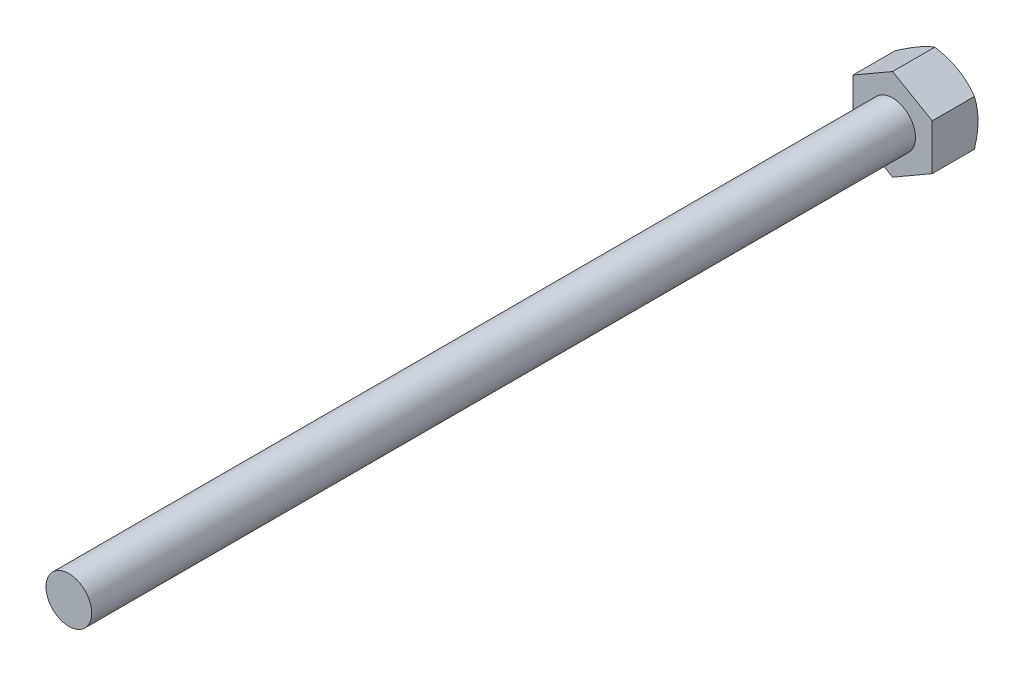
ISO-10303-21;
HEADER;
FILE_DESCRIPTION(('STEP AP214'),'2;1');
FILE_NAME('part.step','',(''),(''),'','','');
FILE_SCHEMA(('AUTOMOTIVE_DESIGN { 1 0 10303 214 1 1 1 1 }'));
ENDSEC;
DATA;
#1=APPLICATION_CONTEXT('core data for automotive mechanical design processes');
#2=APPLICATION_PROTOCOL_DEFINITION('international standard','automotive_design',2000,#1);
#3=PRODUCT_CONTEXT('',#1,'mechanical');
#4=PRODUCT('Part','Part','',(#3));
#5=PRODUCT_RELATED_PRODUCT_CATEGORY('part','',(#4));
#6=PRODUCT_DEFINITION_FORMATION('','',#4);
#7=PRODUCT_DEFINITION_CONTEXT('part definition',#1,'design');
#8=PRODUCT_DEFINITION('design','',#6,#7);
#9=PRODUCT_DEFINITION_SHAPE('','',#8);
#10=(LENGTH_UNIT() NAMED_UNIT(*) SI_UNIT(.MILLI.,.METRE.));
#11=(NAMED_UNIT(*) PLANE_ANGLE_UNIT() SI_UNIT($,.RADIAN.));
#12=(NAMED_UNIT(*) SI_UNIT($,.STERADIAN.) SOLID_ANGLE_UNIT());
#13=UNCERTAINTY_MEASURE_WITH_UNIT(LENGTH_MEASURE(1.E-05),#10,'distance_accuracy_value','');
#14=(GEOMETRIC_REPRESENTATION_CONTEXT(3) GLOBAL_UNCERTAINTY_ASSIGNED_CONTEXT((#13)) GLOBAL_UNIT_ASSIGNED_CONTEXT((#10,
#11,#12)) REPRESENTATION_CONTEXT('',''));
#15=CARTESIAN_POINT('',(0.,0.,0.));
#16=DIRECTION('',(0.,0.,1.));
#17=DIRECTION('',(1.,0.,0.));
#18=AXIS2_PLACEMENT_3D('',#15,#16,#17);
#19=CARTESIAN_POINT('',(0.,0.,-76.));
#20=DIRECTION('',(0.,0.,1.));
#21=DIRECTION('',(1.,0.,0.));
#22=AXIS2_PLACEMENT_3D('',#19,#20,#21);
#23=PLANE('',#22);
#24=CARTESIAN_POINT('',(9.49999999999999,-24.,-76.0000000000218));
#25=DIRECTION('',(0.,0.,1.));
#26=DIRECTION('',(1.,0.,0.));
#27=AXIS2_PLACEMENT_3D('',#24,#25,#26);
#28=CIRCLE('',#27,3.46410161511993);
#29=CARTESIAN_POINT('',(11.2320508075644,-26.9999999999923,-76.0000000000167));
#30=VERTEX_POINT('',#29);
#31=CARTESIAN_POINT('',(12.9641016151288,-24.,-76.0000000000167));
#32=VERTEX_POINT('',#31);
#33=EDGE_CURVE('E89',#30,#32,#28,.T.);
#34=ORIENTED_EDGE('',*,*,#33,.F.);
#35=CARTESIAN_POINT('',(9.49999999999999,-24.,-76.0000000000218));
#36=DIRECTION('',(0.,0.,1.));
#37=DIRECTION('',(1.,0.,0.));
#38=AXIS2_PLACEMENT_3D('',#35,#36,#37);
#39=CIRCLE('',#38,3.46410161511994);
#40=CARTESIAN_POINT('',(7.76794919243556,-26.9999999999923,-76.0000000000167));
#41=VERTEX_POINT('',#40);
#42=EDGE_CURVE('E87',#41,#30,#39,.T.);
#43=ORIENTED_EDGE('',*,*,#42,.F.);
#44=CARTESIAN_POINT('',(9.49999999999999,-24.,-76.0000000000218));
#45=DIRECTION('',(0.,0.,1.));
#46=DIRECTION('',(1.,0.,0.));
#47=AXIS2_PLACEMENT_3D('',#44,#45,#46);
#48=CIRCLE('',#47,3.46410161511993);
#49=CARTESIAN_POINT('',(6.03589838487115,-24.,-76.0000000000167));
#50=VERTEX_POINT('',#49);
#51=EDGE_CURVE('E20',#50,#41,#48,.T.);
#52=ORIENTED_EDGE('',*,*,#51,.F.);
#53=CARTESIAN_POINT('',(9.49999999999999,-24.,-76.0000000000218));
#54=DIRECTION('',(0.,0.,1.));
#55=DIRECTION('',(1.,0.,0.));
#56=AXIS2_PLACEMENT_3D('',#53,#54,#55);
#57=CIRCLE('',#56,3.46410161511994);
#58=CARTESIAN_POINT('',(7.76794919243557,-21.0000000000077,-76.0000000000167));
#59=VERTEX_POINT('',#58);
#60=EDGE_CURVE('E254',#59,#50,#57,.T.);
#61=ORIENTED_EDGE('',*,*,#60,.F.);
#62=CARTESIAN_POINT('',(9.49999999999999,-24.,-76.0000000000218));
#63=DIRECTION('',(0.,0.,1.));
#64=DIRECTION('',(1.,0.,0.));
#65=AXIS2_PLACEMENT_3D('',#62,#63,#64);
#66=CIRCLE('',#65,3.46410161511994);
#67=CARTESIAN_POINT('',(11.2320508075644,-21.0000000000077,-76.0000000000167));
#68=VERTEX_POINT('',#67);
#69=EDGE_CURVE('E256',#68,#59,#66,.T.);
#70=ORIENTED_EDGE('',*,*,#69,.F.);
#71=CARTESIAN_POINT('',(9.49999999999999,-24.,-76.0000000000218));
#72=DIRECTION('',(0.,0.,1.));
#73=DIRECTION('',(1.,0.,0.));
#74=AXIS2_PLACEMENT_3D('',#71,#72,#73);
#75=CIRCLE('',#74,3.46410161511993);
#76=EDGE_CURVE('E259',#32,#68,#75,.T.);
#77=ORIENTED_EDGE('',*,*,#76,.F.);
#78=EDGE_LOOP('',(#34,#43,#52,#61,#70,#77));
#79=FACE_BOUND('',#78,.T.);
#80=ADVANCED_FACE('F17',(#79),#23,.F.);
#81=CARTESIAN_POINT('',(9.49999999999999,-24.,-75.6887425167747));
#82=DIRECTION('',(0.,0.,1.));
#83=DIRECTION('',(1.,0.,0.));
#84=AXIS2_PLACEMENT_3D('',#81,#82,#83);
#85=CONICAL_SURFACE('',#84,4.00321539035257,1.04719755120672);
#86=ORIENTED_EDGE('',*,*,#51,.T.);
#87=CARTESIAN_POINT('',(7.76794919243111,-27.,-76.0000000000115));
#88=CARTESIAN_POINT('',(7.69443335230534,-26.9575556099137,-76.0000141576657));
#89=CARTESIAN_POINT('',(7.62092105368685,-26.9151132645176,-75.9981988123392));
#90=CARTESIAN_POINT('',(7.47404079889175,-26.830311909873,-75.9910143426388));
#91=CARTESIAN_POINT('',(7.40067281702326,-26.7879528857913,-75.9856459218011));
#92=CARTESIAN_POINT('',(7.25455509466502,-26.7035917794544,-75.9714958787991));
#93=CARTESIAN_POINT('',(7.18180409659045,-26.6615889711322,-75.9627314394535));
#94=CARTESIAN_POINT('',(7.0366487113633,-26.577783470397,-75.9419778858792));
#95=CARTESIAN_POINT('',(6.96424433338508,-26.5359807832808,-75.9299886867723));
#96=CARTESIAN_POINT('',(6.74785125175674,-26.4110461793519,-75.889554327723));
#97=CARTESIAN_POINT('',(6.60449117811679,-26.3282772022448,-75.8566227722629));
#98=CARTESIAN_POINT('',(6.31900386451644,-26.1634510248874,-75.7806741823391));
#99=CARTESIAN_POINT('',(6.17688658261098,-26.0813995739228,-75.7376067792515));
#100=CARTESIAN_POINT('',(6.03589838485792,-25.9999999999975,-75.6905989232588));
#101=B_SPLINE_CURVE_WITH_KNOTS('',3,(#87,#88,#89,#90,#91,#92,#93,#94,#95,#96,#97,#98,#99,#100),
.UNSPECIFIED.,.F.,.F.,(4,2,2,2,2,2,4),(0.,0.254640351353358,0.509230297054508,0.762548570682986,
1.01587351249356,1.52185943681017,2.03041495159137),.UNSPECIFIED.);
#102=CARTESIAN_POINT('',(6.03589838486008,-26.0000000000013,-75.6905989232588));
#103=VERTEX_POINT('',#102);
#104=EDGE_CURVE('E97',#41,#103,#101,.T.);
#105=ORIENTED_EDGE('',*,*,#104,.T.);
#106=CARTESIAN_POINT('',(6.03589838486225,-26.000000000005,-75.6905989232588));
#107=CARTESIAN_POINT('',(6.03589838486225,-25.8372008521544,-75.7376067792515));
#108=CARTESIAN_POINT('',(6.03589838486225,-25.6730979502252,-75.7806741823391));
#109=CARTESIAN_POINT('',(6.03589838486224,-25.3434455955104,-75.8566227722629));
#110=CARTESIAN_POINT('',(6.03589838486224,-25.1779076412963,-75.889554327723));
#111=CARTESIAN_POINT('',(6.03589838486224,-24.9280384334385,-75.9299886867723));
#112=CARTESIAN_POINT('',(6.03589838486224,-24.844433059206,-75.9419778858792));
#113=CARTESIAN_POINT('',(6.03589838486224,-24.6768220577356,-75.9627314394535));
#114=CARTESIAN_POINT('',(6.03589838486224,-24.5928164410913,-75.9714958787991));
#115=CARTESIAN_POINT('',(6.03589838486224,-24.4240942284174,-75.9856459218012));
#116=CARTESIAN_POINT('',(6.03589838486224,-24.3393761802541,-75.9910143426388));
#117=CARTESIAN_POINT('',(6.03589838486224,-24.1697734709649,-75.9981988123392));
#118=CARTESIAN_POINT('',(6.03589838486224,-24.0848887801726,-76.0000141576658));
#119=CARTESIAN_POINT('',(6.03589838486224,-24.,-76.0000000000115));
#120=B_SPLINE_CURVE_WITH_KNOTS('',3,(#106,#107,#108,#109,#110,#111,#112,#113,#114,#115,#116,
#117,#118,#119),.UNSPECIFIED.,.F.,.F.,(4,2,2,2,2,2,4),(0.,0.508555514781208,1.01454143909782,
1.26786638090839,1.52118465453688,1.77577460023803,2.03041495159139),.UNSPECIFIED.);
#121=EDGE_CURVE('E99',#103,#50,#120,.T.);
#122=ORIENTED_EDGE('',*,*,#121,.T.);
#123=EDGE_LOOP('',(#86,#105,#122));
#124=FACE_BOUND('',#123,.T.);
#125=ADVANCED_FACE('F95',(#124),#85,.T.);
#126=CARTESIAN_POINT('',(9.49999999999999,-24.,-75.6887425167747));
#127=DIRECTION('',(0.,0.,1.));
#128=DIRECTION('',(1.,0.,0.));
#129=AXIS2_PLACEMENT_3D('',#126,#127,#128);
#130=CONICAL_SURFACE('',#129,4.00321539035257,1.04719755120672);
#131=CARTESIAN_POINT('',(9.50000000000429,-28.0000000000025,-75.6905989232588));
#132=CARTESIAN_POINT('',(9.35901180225123,-27.9186004260772,-75.7376067792515));
#133=CARTESIAN_POINT('',(9.21689452034578,-27.8365489751126,-75.7806741823391));
#134=CARTESIAN_POINT('',(8.93140720674542,-27.6717227977552,-75.8566227722628));
#135=CARTESIAN_POINT('',(8.78804713310547,-27.5889538206481,-75.889554327723));
#136=CARTESIAN_POINT('',(8.57165405147713,-27.4640192167192,-75.9299886867723));
#137=CARTESIAN_POINT('',(8.49924967349892,-27.422216529603,-75.9419778858792));
#138=CARTESIAN_POINT('',(8.35409428827176,-27.3384110288678,-75.9627314394535));
#139=CARTESIAN_POINT('',(8.28134329019719,-27.2964082205456,-75.9714958787991));
#140=CARTESIAN_POINT('',(8.13522556783896,-27.2120471142087,-75.9856459218011));
#141=CARTESIAN_POINT('',(8.06185758597047,-27.169688090127,-75.9910143426388));
#142=CARTESIAN_POINT('',(7.91497733117537,-27.0848867354825,-75.9981988123392));
#143=CARTESIAN_POINT('',(7.84146503255687,-27.0424443900863,-76.0000141576657));
#144=CARTESIAN_POINT('',(7.76794919243111,-27.,-76.0000000000115));
#145=B_SPLINE_CURVE_WITH_KNOTS('',3,(#131,#132,#133,#134,#135,#136,#137,#138,#139,#140,#141,
#142,#143,#144),.UNSPECIFIED.,.F.,.F.,(4,2,2,2,2,2,4),(0.,0.508555514781195,1.0145414390978,
1.26786638090837,1.52118465453685,1.775774600238,2.03041495159136),.UNSPECIFIED.);
#146=CARTESIAN_POINT('',(9.49999999999996,-28.0000000000025,-75.6905989232588));
#147=VERTEX_POINT('',#146);
#148=EDGE_CURVE('E102',#147,#41,#145,.T.);
#149=ORIENTED_EDGE('',*,*,#148,.T.);
#150=ORIENTED_EDGE('',*,*,#42,.T.);
#151=CARTESIAN_POINT('',(11.2320508075688,-27.,-76.0000000000115));
#152=CARTESIAN_POINT('',(11.1585349674431,-27.0424443900863,-76.0000141576658));
#153=CARTESIAN_POINT('',(11.0850226688246,-27.0848867354825,-75.9981988123392));
#154=CARTESIAN_POINT('',(10.9381424140295,-27.169688090127,-75.9910143426388));
#155=CARTESIAN_POINT('',(10.864774432161,-27.2120471142087,-75.9856459218012));
#156=CARTESIAN_POINT('',(10.7186567098028,-27.2964082205456,-75.9714958787991));
#157=CARTESIAN_POINT('',(10.6459057117282,-27.3384110288678,-75.9627314394535));
#158=CARTESIAN_POINT('',(10.500750326501,-27.422216529603,-75.9419778858792));
#159=CARTESIAN_POINT('',(10.4283459485228,-27.4640192167192,-75.9299886867723));
#160=CARTESIAN_POINT('',(10.2119528668945,-27.5889538206481,-75.889554327723));
#161=CARTESIAN_POINT('',(10.0685927932545,-27.6717227977552,-75.8566227722629));
#162=CARTESIAN_POINT('',(9.78310547965415,-27.8365489751126,-75.7806741823391));
#163=CARTESIAN_POINT('',(9.6409881977487,-27.9186004260772,-75.7376067792515));
#164=CARTESIAN_POINT('',(9.49999999999564,-28.0000000000025,-75.6905989232588));
#165=B_SPLINE_CURVE_WITH_KNOTS('',3,(#151,#152,#153,#154,#155,#156,#157,#158,#159,#160,#161,
#162,#163,#164),.UNSPECIFIED.,.F.,.F.,(4,2,2,2,2,2,4),(0.,0.254640351353363,0.509230297054516,
0.762548570683,1.01587351249357,1.52185943681019,2.03041495159139),.UNSPECIFIED.);
#166=EDGE_CURVE('E105',#30,#147,#165,.T.);
#167=ORIENTED_EDGE('',*,*,#166,.T.);
#168=EDGE_LOOP('',(#149,#150,#167));
#169=FACE_BOUND('',#168,.T.);
#170=ADVANCED_FACE('F103',(#169),#130,.T.);
#171=CARTESIAN_POINT('',(9.49999999999999,-24.,-75.6887425167747));
#172=DIRECTION('',(0.,0.,1.));
#173=DIRECTION('',(1.,0.,0.));
#174=AXIS2_PLACEMENT_3D('',#171,#172,#173);
#175=CONICAL_SURFACE('',#174,4.00321539035257,1.04719755120672);
#176=CARTESIAN_POINT('',(12.9641016151421,-25.9999999999975,-75.6905989232588));
#177=CARTESIAN_POINT('',(12.823113417389,-26.0813995739228,-75.7376067792515));
#178=CARTESIAN_POINT('',(12.6809961354835,-26.1634510248874,-75.7806741823391));
#179=CARTESIAN_POINT('',(12.3955088218832,-26.3282772022448,-75.8566227722629));
#180=CARTESIAN_POINT('',(12.2521487482432,-26.4110461793519,-75.889554327723));
#181=CARTESIAN_POINT('',(12.0357556666149,-26.5359807832808,-75.9299886867723));
#182=CARTESIAN_POINT('',(11.9633512886367,-26.577783470397,-75.9419778858792));
#183=CARTESIAN_POINT('',(11.8181959034095,-26.6615889711322,-75.9627314394535));
#184=CARTESIAN_POINT('',(11.7454449053349,-26.7035917794544,-75.9714958787991));
#185=CARTESIAN_POINT('',(11.5993271829767,-26.7879528857913,-75.9856459218012));
#186=CARTESIAN_POINT('',(11.5259592011082,-26.830311909873,-75.9910143426388));
#187=CARTESIAN_POINT('',(11.3790789463131,-26.9151132645176,-75.9981988123392));
#188=CARTESIAN_POINT('',(11.3055666476946,-26.9575556099137,-76.0000141576658));
#189=CARTESIAN_POINT('',(11.2320508075688,-27.,-76.0000000000115));
#190=B_SPLINE_CURVE_WITH_KNOTS('',3,(#176,#177,#178,#179,#180,#181,#182,#183,#184,#185,#186,
#187,#188,#189),.UNSPECIFIED.,.F.,.F.,(4,2,2,2,2,2,4),(0.,0.508555514781204,1.01454143909782,
1.26786638090839,1.52118465453687,1.77577460023803,2.03041495159139),.UNSPECIFIED.);
#191=CARTESIAN_POINT('',(12.9641016151399,-26.0000000000013,-75.6905989232588));
#192=VERTEX_POINT('',#191);
#193=EDGE_CURVE('E148',#192,#30,#190,.T.);
#194=ORIENTED_EDGE('',*,*,#193,.T.);
#195=ORIENTED_EDGE('',*,*,#33,.T.);
#196=CARTESIAN_POINT('',(12.9641016151377,-24.,-76.0000000000115));
#197=CARTESIAN_POINT('',(12.9641016151377,-24.0848887801726,-76.0000141576658));
#198=CARTESIAN_POINT('',(12.9641016151377,-24.1697734709649,-75.9981988123392));
#199=CARTESIAN_POINT('',(12.9641016151377,-24.3393761802541,-75.9910143426388));
#200=CARTESIAN_POINT('',(12.9641016151377,-24.4240942284174,-75.9856459218012));
#201=CARTESIAN_POINT('',(12.9641016151377,-24.5928164410913,-75.9714958787991));
#202=CARTESIAN_POINT('',(12.9641016151377,-24.6768220577356,-75.9627314394535));
#203=CARTESIAN_POINT('',(12.9641016151377,-24.844433059206,-75.9419778858792));
#204=CARTESIAN_POINT('',(12.9641016151377,-24.9280384334385,-75.9299886867723));
#205=CARTESIAN_POINT('',(12.9641016151377,-25.1779076412963,-75.889554327723));
#206=CARTESIAN_POINT('',(12.9641016151377,-25.3434455955104,-75.8566227722629));
#207=CARTESIAN_POINT('',(12.9641016151377,-25.6730979502252,-75.7806741823391));
#208=CARTESIAN_POINT('',(12.9641016151377,-25.8372008521544,-75.7376067792515));
#209=CARTESIAN_POINT('',(12.9641016151377,-26.000000000005,-75.6905989232588));
#210=B_SPLINE_CURVE_WITH_KNOTS('',3,(#196,#197,#198,#199,#200,#201,#202,#203,#204,#205,#206,
#207,#208,#209),.UNSPECIFIED.,.F.,.F.,(4,2,2,2,2,2,4),(0.,0.254640351353364,0.509230297054517,
0.762548570683004,1.01587351249358,1.52185943681019,2.0304149515914),.UNSPECIFIED.);
#211=EDGE_CURVE('E174',#32,#192,#210,.T.);
#212=ORIENTED_EDGE('',*,*,#211,.T.);
#213=EDGE_LOOP('',(#194,#195,#212));
#214=FACE_BOUND('',#213,.T.);
#215=ADVANCED_FACE('F139',(#214),#175,.T.);
#216=CARTESIAN_POINT('',(9.49999999999999,-24.,-75.6887425167747));
#217=DIRECTION('',(0.,0.,1.));
#218=DIRECTION('',(1.,0.,0.));
#219=AXIS2_PLACEMENT_3D('',#216,#217,#218);
#220=CONICAL_SURFACE('',#219,4.00321539035257,1.04719755120672);
#221=CARTESIAN_POINT('',(12.9641016151377,-21.999999999995,-75.6905989232588));
#222=CARTESIAN_POINT('',(12.9641016151377,-22.1627991478456,-75.7376067792515));
#223=CARTESIAN_POINT('',(12.9641016151377,-22.3269020497748,-75.7806741823391));
#224=CARTESIAN_POINT('',(12.9641016151377,-22.6565544044896,-75.8566227722629));
#225=CARTESIAN_POINT('',(12.9641016151377,-22.8220923587037,-75.889554327723));
#226=CARTESIAN_POINT('',(12.9641016151377,-23.0719615665615,-75.9299886867723));
#227=CARTESIAN_POINT('',(12.9641016151377,-23.155566940794,-75.9419778858792));
#228=CARTESIAN_POINT('',(12.9641016151377,-23.3231779422644,-75.9627314394535));
#229=CARTESIAN_POINT('',(12.9641016151377,-23.4071835589088,-75.9714958787991));
#230=CARTESIAN_POINT('',(12.9641016151377,-23.5759057715826,-75.9856459218012));
#231=CARTESIAN_POINT('',(12.9641016151377,-23.6606238197459,-75.9910143426388));
#232=CARTESIAN_POINT('',(12.9641016151377,-23.8302265290351,-75.9981988123392));
#233=CARTESIAN_POINT('',(12.9641016151377,-23.9151112198274,-76.0000141576658));
#234=CARTESIAN_POINT('',(12.9641016151377,-24.,-76.0000000000115));
#235=B_SPLINE_CURVE_WITH_KNOTS('',3,(#221,#222,#223,#224,#225,#226,#227,#228,#229,#230,#231,
#232,#233,#234),.UNSPECIFIED.,.F.,.F.,(4,2,2,2,2,2,4),(0.,0.508555514781211,1.01454143909782,
1.26786638090839,1.52118465453688,1.77577460023803,2.03041495159139),.UNSPECIFIED.);
#236=CARTESIAN_POINT('',(12.9641016151399,-21.9999999999988,-75.6905989232588));
#237=VERTEX_POINT('',#236);
#238=EDGE_CURVE('E169',#237,#32,#235,.T.);
#239=ORIENTED_EDGE('',*,*,#238,.T.);
#240=ORIENTED_EDGE('',*,*,#76,.T.);
#241=CARTESIAN_POINT('',(11.2320508075689,-21.,-76.0000000000115));
#242=CARTESIAN_POINT('',(11.3055666476946,-21.0424443900863,-76.0000141576658));
#243=CARTESIAN_POINT('',(11.3790789463131,-21.0848867354825,-75.9981988123392));
#244=CARTESIAN_POINT('',(11.5259592011082,-21.169688090127,-75.9910143426388));
#245=CARTESIAN_POINT('',(11.5993271829767,-21.2120471142087,-75.9856459218012));
#246=CARTESIAN_POINT('',(11.745444905335,-21.2964082205456,-75.9714958787991));
#247=CARTESIAN_POINT('',(11.8181959034095,-21.3384110288678,-75.9627314394535));
#248=CARTESIAN_POINT('',(11.9633512886367,-21.422216529603,-75.9419778858792));
#249=CARTESIAN_POINT('',(12.0357556666149,-21.4640192167192,-75.9299886867723));
#250=CARTESIAN_POINT('',(12.2521487482433,-21.5889538206481,-75.889554327723));
#251=CARTESIAN_POINT('',(12.3955088218832,-21.6717227977552,-75.8566227722629));
#252=CARTESIAN_POINT('',(12.6809961354836,-21.8365489751126,-75.7806741823391));
#253=CARTESIAN_POINT('',(12.823113417389,-21.9186004260772,-75.7376067792515));
#254=CARTESIAN_POINT('',(12.9641016151421,-22.0000000000025,-75.6905989232588));
#255=B_SPLINE_CURVE_WITH_KNOTS('',3,(#241,#242,#243,#244,#245,#246,#247,#248,#249,#250,#251,
#252,#253,#254),.UNSPECIFIED.,.F.,.F.,(4,2,2,2,2,2,4),(0.,0.254640351353365,0.509230297054519,
0.762548570683002,1.01587351249357,1.52185943681019,2.03041495159139),.UNSPECIFIED.);
#256=EDGE_CURVE('E268',#68,#237,#255,.T.);
#257=ORIENTED_EDGE('',*,*,#256,.T.);
#258=EDGE_LOOP('',(#239,#240,#257));
#259=FACE_BOUND('',#258,.T.);
#260=ADVANCED_FACE('F265',(#259),#220,.T.);
#261=CARTESIAN_POINT('',(9.49999999999999,-24.,-75.6887425167747));
#262=DIRECTION('',(0.,0.,1.));
#263=DIRECTION('',(1.,0.,0.));
#264=AXIS2_PLACEMENT_3D('',#261,#262,#263);
#265=CONICAL_SURFACE('',#264,4.00321539035257,1.04719755120672);
#266=CARTESIAN_POINT('',(9.49999999999566,-19.9999999999975,-75.6905989232588));
#267=CARTESIAN_POINT('',(9.64098819774872,-20.0813995739228,-75.7376067792515));
#268=CARTESIAN_POINT('',(9.78310547965418,-20.1634510248874,-75.7806741823391));
#269=CARTESIAN_POINT('',(10.0685927932545,-20.3282772022448,-75.8566227722628));
#270=CARTESIAN_POINT('',(10.2119528668945,-20.4110461793519,-75.889554327723));
#271=CARTESIAN_POINT('',(10.4283459485228,-20.5359807832808,-75.9299886867723));
#272=CARTESIAN_POINT('',(10.500750326501,-20.577783470397,-75.9419778858792));
#273=CARTESIAN_POINT('',(10.6459057117282,-20.6615889711322,-75.9627314394535));
#274=CARTESIAN_POINT('',(10.7186567098028,-20.7035917794544,-75.9714958787991));
#275=CARTESIAN_POINT('',(10.864774432161,-20.7879528857913,-75.9856459218012));
#276=CARTESIAN_POINT('',(10.9381424140295,-20.830311909873,-75.9910143426388));
#277=CARTESIAN_POINT('',(11.0850226688246,-20.9151132645176,-75.9981988123392));
#278=CARTESIAN_POINT('',(11.1585349674431,-20.9575556099137,-76.0000141576658));
#279=CARTESIAN_POINT('',(11.2320508075689,-21.,-76.0000000000115));
#280=B_SPLINE_CURVE_WITH_KNOTS('',3,(#266,#267,#268,#269,#270,#271,#272,#273,#274,#275,#276,
#277,#278,#279),.UNSPECIFIED.,.F.,.F.,(4,2,2,2,2,2,4),(0.,0.508555514781203,1.01454143909782,
1.2678663809084,1.52118465453688,1.77577460023804,2.0304149515914),.UNSPECIFIED.);
#281=CARTESIAN_POINT('',(9.49999999999999,-19.9999999999975,-75.6905989232588));
#282=VERTEX_POINT('',#281);
#283=EDGE_CURVE('E291',#282,#68,#280,.T.);
#284=ORIENTED_EDGE('',*,*,#283,.T.);
#285=ORIENTED_EDGE('',*,*,#69,.T.);
#286=CARTESIAN_POINT('',(7.76794919243111,-21.,-76.0000000000115));
#287=CARTESIAN_POINT('',(7.84146503255688,-20.9575556099137,-76.0000141576657));
#288=CARTESIAN_POINT('',(7.91497733117537,-20.9151132645176,-75.9981988123392));
#289=CARTESIAN_POINT('',(8.06185758597047,-20.830311909873,-75.9910143426388));
#290=CARTESIAN_POINT('',(8.13522556783896,-20.7879528857913,-75.9856459218011));
#291=CARTESIAN_POINT('',(8.2813432901972,-20.7035917794544,-75.9714958787991));
#292=CARTESIAN_POINT('',(8.35409428827178,-20.6615889711322,-75.9627314394535));
#293=CARTESIAN_POINT('',(8.49924967349893,-20.577783470397,-75.9419778858792));
#294=CARTESIAN_POINT('',(8.57165405147714,-20.5359807832808,-75.9299886867723));
#295=CARTESIAN_POINT('',(8.78804713310549,-20.4110461793519,-75.889554327723));
#296=CARTESIAN_POINT('',(8.93140720674544,-20.3282772022448,-75.8566227722628));
#297=CARTESIAN_POINT('',(9.21689452034579,-20.1634510248874,-75.7806741823391));
#298=CARTESIAN_POINT('',(9.35901180225125,-20.0813995739228,-75.7376067792515));
#299=CARTESIAN_POINT('',(9.50000000000432,-19.9999999999975,-75.6905989232588));
#300=B_SPLINE_CURVE_WITH_KNOTS('',3,(#286,#287,#288,#289,#290,#291,#292,#293,#294,#295,#296,
#297,#298,#299),.UNSPECIFIED.,.F.,.F.,(4,2,2,2,2,2,4),(0.,0.254640351353362,0.509230297054515,
0.762548570682999,1.01587351249357,1.52185943681019,2.03041495159139),.UNSPECIFIED.);
#301=EDGE_CURVE('E232',#59,#282,#300,.T.);
#302=ORIENTED_EDGE('',*,*,#301,.T.);
#303=EDGE_LOOP('',(#284,#285,#302));
#304=FACE_BOUND('',#303,.T.);
#305=ADVANCED_FACE('F245',(#304),#265,.T.);
#306=CARTESIAN_POINT('',(9.49999999999999,-24.,-75.6887425167747));
#307=DIRECTION('',(0.,0.,1.));
#308=DIRECTION('',(1.,0.,0.));
#309=AXIS2_PLACEMENT_3D('',#306,#307,#308);
#310=CONICAL_SURFACE('',#309,4.00321539035257,1.04719755120672);
#311=CARTESIAN_POINT('',(6.0358983848579,-22.0000000000025,-75.6905989232588));
#312=CARTESIAN_POINT('',(6.17688658261097,-21.9186004260772,-75.7376067792515));
#313=CARTESIAN_POINT('',(6.31900386451642,-21.8365489751126,-75.7806741823391));
#314=CARTESIAN_POINT('',(6.60449117811677,-21.6717227977552,-75.8566227722628));
#315=CARTESIAN_POINT('',(6.74785125175672,-21.5889538206481,-75.889554327723));
#316=CARTESIAN_POINT('',(6.96424433338507,-21.4640192167192,-75.9299886867723));
#317=CARTESIAN_POINT('',(7.03664871136329,-21.422216529603,-75.9419778858792));
#318=CARTESIAN_POINT('',(7.18180409659044,-21.3384110288678,-75.9627314394535));
#319=CARTESIAN_POINT('',(7.25455509466502,-21.2964082205456,-75.9714958787991));
#320=CARTESIAN_POINT('',(7.40067281702326,-21.2120471142087,-75.9856459218011));
#321=CARTESIAN_POINT('',(7.47404079889175,-21.169688090127,-75.9910143426388));
#322=CARTESIAN_POINT('',(7.62092105368685,-21.0848867354825,-75.9981988123392));
#323=CARTESIAN_POINT('',(7.69443335230534,-21.0424443900863,-76.0000141576657));
#324=CARTESIAN_POINT('',(7.76794919243111,-21.,-76.0000000000115));
#325=B_SPLINE_CURVE_WITH_KNOTS('',3,(#311,#312,#313,#314,#315,#316,#317,#318,#319,#320,#321,
#322,#323,#324),.UNSPECIFIED.,.F.,.F.,(4,2,2,2,2,2,4),(0.,0.5085555147812,1.01454143909782,
1.26786638090839,1.52118465453688,1.77577460023803,2.03041495159139),.UNSPECIFIED.);
#326=CARTESIAN_POINT('',(6.03589838486223,-21.9999999999975,-75.6905989232595));
#327=VERTEX_POINT('',#326);
#328=EDGE_CURVE('E196',#327,#59,#325,.T.);
#329=ORIENTED_EDGE('',*,*,#328,.T.);
#330=ORIENTED_EDGE('',*,*,#60,.T.);
#331=CARTESIAN_POINT('',(6.03589838486224,-24.,-76.0000000000115));
#332=CARTESIAN_POINT('',(6.03589838486224,-23.9151112198274,-76.0000141576658));
#333=CARTESIAN_POINT('',(6.03589838486224,-23.8302265290351,-75.9981988123392));
#334=CARTESIAN_POINT('',(6.03589838486224,-23.6606238197459,-75.9910143426388));
#335=CARTESIAN_POINT('',(6.03589838486224,-23.5759057715826,-75.9856459218012));
#336=CARTESIAN_POINT('',(6.03589838486224,-23.4071835589088,-75.9714958787991));
#337=CARTESIAN_POINT('',(6.03589838486224,-23.3231779422644,-75.9627314394535));
#338=CARTESIAN_POINT('',(6.03589838486224,-23.155566940794,-75.9419778858792));
#339=CARTESIAN_POINT('',(6.03589838486224,-23.0719615665615,-75.9299886867723));
#340=CARTESIAN_POINT('',(6.03589838486224,-22.8220923587037,-75.889554327723));
#341=CARTESIAN_POINT('',(6.03589838486224,-22.6565544044896,-75.8566227722629));
#342=CARTESIAN_POINT('',(6.03589838486223,-22.3269020497748,-75.7806741823391));
#343=CARTESIAN_POINT('',(6.03589838486223,-22.1627991478456,-75.7376067792515));
#344=CARTESIAN_POINT('',(6.03589838486223,-21.999999999995,-75.6905989232588));
#345=B_SPLINE_CURVE_WITH_KNOTS('',3,(#331,#332,#333,#334,#335,#336,#337,#338,#339,#340,#341,
#342,#343,#344),.UNSPECIFIED.,.F.,.F.,(4,2,2,2,2,2,4),(0.,0.254640351353364,0.509230297054517,
0.762548570683004,1.01587351249358,1.52185943681019,2.0304149515914),.UNSPECIFIED.);
#346=EDGE_CURVE('E115',#50,#327,#345,.T.);
#347=ORIENTED_EDGE('',*,*,#346,.T.);
#348=EDGE_LOOP('',(#329,#330,#347));
#349=FACE_BOUND('',#348,.T.);
#350=ADVANCED_FACE('F241',(#349),#310,.T.);
#351=CARTESIAN_POINT('',(6.03589838486223,-22.,-76.));
#352=DIRECTION('',(1.,0.,0.));
#353=DIRECTION('',(0.,1.,0.));
#354=AXIS2_PLACEMENT_3D('',#351,#352,#353);
#355=PLANE('',#354);
#356=DIRECTION('',(0.,0.,1.));
#357=VECTOR('',#356,1.);
#358=CARTESIAN_POINT('',(6.03589838486225,-26.,-76.));
#359=LINE('',#358,#357);
#360=CARTESIAN_POINT('',(6.03589838486224,-26.,-72.));
#361=VERTEX_POINT('',#360);
#362=EDGE_CURVE('E108',#103,#361,#359,.T.);
#363=ORIENTED_EDGE('',*,*,#362,.T.);
#364=DIRECTION('',(0.,1.,0.));
#365=VECTOR('',#364,1.);
#366=CARTESIAN_POINT('',(6.03589838486223,0.,-72.));
#367=LINE('',#366,#365);
#368=CARTESIAN_POINT('',(6.03589838486223,-22.,-72.));
#369=VERTEX_POINT('',#368);
#370=EDGE_CURVE('E192',#369,#361,#367,.F.);
#371=ORIENTED_EDGE('',*,*,#370,.F.);
#372=DIRECTION('',(0.,0.,1.));
#373=VECTOR('',#372,1.);
#374=CARTESIAN_POINT('',(6.03589838486223,-22.,-76.));
#375=LINE('',#374,#373);
#376=EDGE_CURVE('E231',#369,#327,#375,.F.);
#377=ORIENTED_EDGE('',*,*,#376,.T.);
#378=ORIENTED_EDGE('',*,*,#346,.F.);
#379=ORIENTED_EDGE('',*,*,#121,.F.);
#380=EDGE_LOOP('',(#363,#371,#377,#378,#379));
#381=FACE_BOUND('',#380,.T.);
#382=ADVANCED_FACE('F244',(#381),#355,.F.);
#383=CARTESIAN_POINT('',(6.03589838486225,-26.,-76.));
#384=DIRECTION('',(0.500000000000001,0.866025403784438,0.));
#385=DIRECTION('',(-0.866025403784438,0.500000000000001,0.));
#386=AXIS2_PLACEMENT_3D('',#383,#384,#385);
#387=PLANE('',#386);
#388=DIRECTION('',(0.,0.,1.));
#389=VECTOR('',#388,1.);
#390=CARTESIAN_POINT('',(9.49999999999996,-28.,-76.));
#391=LINE('',#390,#389);
#392=CARTESIAN_POINT('',(9.49999999999996,-28.,-72.));
#393=VERTEX_POINT('',#392);
#394=EDGE_CURVE('E147',#147,#393,#391,.T.);
#395=ORIENTED_EDGE('',*,*,#394,.T.);
#396=DIRECTION('',(0.866025403784438,-0.5,0.));
#397=VECTOR('',#396,1.);
#398=CARTESIAN_POINT('',(6.03589838486225,-26.,-72.));
#399=LINE('',#398,#397);
#400=EDGE_CURVE('E195',#361,#393,#399,.T.);
#401=ORIENTED_EDGE('',*,*,#400,.F.);
#402=ORIENTED_EDGE('',*,*,#362,.F.);
#403=ORIENTED_EDGE('',*,*,#104,.F.);
#404=ORIENTED_EDGE('',*,*,#148,.F.);
#405=EDGE_LOOP('',(#395,#401,#402,#403,#404));
#406=FACE_BOUND('',#405,.T.);
#407=ADVANCED_FACE('F111',(#406),#387,.F.);
#408=CARTESIAN_POINT('',(9.49999999999996,-28.,-76.));
#409=DIRECTION('',(-0.499999999999995,0.866025403784442,0.));
#410=DIRECTION('',(-0.866025403784442,-0.499999999999995,0.));
#411=AXIS2_PLACEMENT_3D('',#408,#409,#410);
#412=PLANE('',#411);
#413=DIRECTION('',(0.,0.,1.));
#414=VECTOR('',#413,1.);
#415=CARTESIAN_POINT('',(12.9641016151377,-26.,-76.));
#416=LINE('',#415,#414);
#417=CARTESIAN_POINT('',(12.9641016151377,-26.,-72.));
#418=VERTEX_POINT('',#417);
#419=EDGE_CURVE('E178',#192,#418,#416,.T.);
#420=ORIENTED_EDGE('',*,*,#419,.T.);
#421=DIRECTION('',(0.866025403784442,0.499999999999994,0.));
#422=VECTOR('',#421,1.);
#423=CARTESIAN_POINT('',(9.49999999999996,-28.,-72.));
#424=LINE('',#423,#422);
#425=EDGE_CURVE('E212',#393,#418,#424,.T.);
#426=ORIENTED_EDGE('',*,*,#425,.F.);
#427=ORIENTED_EDGE('',*,*,#394,.F.);
#428=ORIENTED_EDGE('',*,*,#166,.F.);
#429=ORIENTED_EDGE('',*,*,#193,.F.);
#430=EDGE_LOOP('',(#420,#426,#427,#428,#429));
#431=FACE_BOUND('',#430,.T.);
#432=ADVANCED_FACE('F153',(#431),#412,.F.);
#433=CARTESIAN_POINT('',(12.9641016151377,-26.,-76.));
#434=DIRECTION('',(-1.,0.,0.));
#435=DIRECTION('',(0.,-1.,0.));
#436=AXIS2_PLACEMENT_3D('',#433,#434,#435);
#437=PLANE('',#436);
#438=DIRECTION('',(0.,0.,1.));
#439=VECTOR('',#438,1.);
#440=CARTESIAN_POINT('',(12.9641016151377,-22.,-76.));
#441=LINE('',#440,#439);
#442=CARTESIAN_POINT('',(12.9641016151377,-22.,-72.));
#443=VERTEX_POINT('',#442);
#444=EDGE_CURVE('E289',#237,#443,#441,.T.);
#445=ORIENTED_EDGE('',*,*,#444,.T.);
#446=DIRECTION('',(0.,1.,0.));
#447=VECTOR('',#446,1.);
#448=CARTESIAN_POINT('',(12.9641016151377,0.,-72.));
#449=LINE('',#448,#447);
#450=EDGE_CURVE('E207',#418,#443,#449,.T.);
#451=ORIENTED_EDGE('',*,*,#450,.F.);
#452=ORIENTED_EDGE('',*,*,#419,.F.);
#453=ORIENTED_EDGE('',*,*,#211,.F.);
#454=ORIENTED_EDGE('',*,*,#238,.F.);
#455=EDGE_LOOP('',(#445,#451,#452,#453,#454));
#456=FACE_BOUND('',#455,.T.);
#457=ADVANCED_FACE('F157',(#456),#437,.F.);
#458=CARTESIAN_POINT('',(12.9641016151377,-22.,-76.));
#459=DIRECTION('',(-0.500000000000001,-0.866025403784438,0.));
#460=DIRECTION('',(0.866025403784438,-0.500000000000001,0.));
#461=AXIS2_PLACEMENT_3D('',#458,#459,#460);
#462=PLANE('',#461);
#463=DIRECTION('',(0.,0.,1.));
#464=VECTOR('',#463,1.);
#465=CARTESIAN_POINT('',(9.49999999999999,-20.,-76.));
#466=LINE('',#465,#464);
#467=CARTESIAN_POINT('',(9.49999999999999,-20.,-72.));
#468=VERTEX_POINT('',#467);
#469=EDGE_CURVE('E35',#282,#468,#466,.T.);
#470=ORIENTED_EDGE('',*,*,#469,.T.);
#471=DIRECTION('',(-0.866025403784437,0.500000000000002,0.));
#472=VECTOR('',#471,1.);
#473=CARTESIAN_POINT('',(12.9641016151377,-22.,-72.));
#474=LINE('',#473,#472);
#475=EDGE_CURVE('E202',#443,#468,#474,.T.);
#476=ORIENTED_EDGE('',*,*,#475,.F.);
#477=ORIENTED_EDGE('',*,*,#444,.F.);
#478=ORIENTED_EDGE('',*,*,#256,.F.);
#479=ORIENTED_EDGE('',*,*,#283,.F.);
#480=EDGE_LOOP('',(#470,#476,#477,#478,#479));
#481=FACE_BOUND('',#480,.T.);
#482=ADVANCED_FACE('F163',(#481),#462,.F.);
#483=CARTESIAN_POINT('',(9.49999999999999,-20.,-76.));
#484=DIRECTION('',(0.500000000000001,-0.866025403784438,0.));
#485=DIRECTION('',(0.866025403784438,0.500000000000001,0.));
#486=AXIS2_PLACEMENT_3D('',#483,#484,#485);
#487=PLANE('',#486);
#488=ORIENTED_EDGE('',*,*,#376,.F.);
#489=DIRECTION('',(-0.866025403784437,-0.500000000000002,0.));
#490=VECTOR('',#489,1.);
#491=CARTESIAN_POINT('',(9.49999999999999,-20.,-72.));
#492=LINE('',#491,#490);
#493=EDGE_CURVE('E199',#468,#369,#492,.T.);
#494=ORIENTED_EDGE('',*,*,#493,.F.);
#495=ORIENTED_EDGE('',*,*,#469,.F.);
#496=ORIENTED_EDGE('',*,*,#301,.F.);
#497=ORIENTED_EDGE('',*,*,#328,.F.);
#498=EDGE_LOOP('',(#488,#494,#495,#496,#497));
#499=FACE_BOUND('',#498,.T.);
#500=ADVANCED_FACE('F238',(#499),#487,.F.);
#501=CARTESIAN_POINT('',(0.,0.,-72.));
#502=DIRECTION('',(0.,0.,1.));
#503=DIRECTION('',(1.,0.,0.));
#504=AXIS2_PLACEMENT_3D('',#501,#502,#503);
#505=PLANE('',#504);
#506=ORIENTED_EDGE('',*,*,#475,.T.);
#507=ORIENTED_EDGE('',*,*,#493,.T.);
#508=ORIENTED_EDGE('',*,*,#370,.T.);
#509=ORIENTED_EDGE('',*,*,#400,.T.);
#510=ORIENTED_EDGE('',*,*,#425,.T.);
#511=ORIENTED_EDGE('',*,*,#450,.T.);
#512=EDGE_LOOP('',(#506,#507,#508,#509,#510,#511));
#513=FACE_BOUND('',#512,.T.);
#514=CARTESIAN_POINT('',(9.49999999999999,-24.,-72.));
#515=DIRECTION('',(0.,0.,1.));
#516=DIRECTION('',(1.,0.,0.));
#517=AXIS2_PLACEMENT_3D('',#514,#515,#516);
#518=CIRCLE('',#517,2.);
#519=CARTESIAN_POINT('',(11.5,-24.,-72.));
#520=VERTEX_POINT('',#519);
#521=EDGE_CURVE('E26',#520,#520,#518,.T.);
#522=ORIENTED_EDGE('',*,*,#521,.F.);
#523=EDGE_LOOP('',(#522));
#524=FACE_BOUND('',#523,.T.);
#525=ADVANCED_FACE('F273',(#513,#524),#505,.T.);
#526=CARTESIAN_POINT('',(9.49999999999999,-24.,0.));
#527=DIRECTION('',(0.,0.,1.));
#528=DIRECTION('',(1.,0.,0.));
#529=AXIS2_PLACEMENT_3D('',#526,#527,#528);
#530=PLANE('',#529);
#531=CARTESIAN_POINT('',(9.49999999999999,-24.,0.));
#532=DIRECTION('',(0.,0.,1.));
#533=DIRECTION('',(1.,0.,0.));
#534=AXIS2_PLACEMENT_3D('',#531,#532,#533);
#535=CIRCLE('',#534,2.);
#536=CARTESIAN_POINT('',(11.5,-24.,0.));
#537=VERTEX_POINT('',#536);
#538=EDGE_CURVE('E11',#537,#537,#535,.F.);
#539=ORIENTED_EDGE('',*,*,#538,.F.);
#540=EDGE_LOOP('',(#539));
#541=FACE_BOUND('',#540,.T.);
#542=ADVANCED_FACE('F310',(#541),#530,.T.);
#543=CARTESIAN_POINT('',(9.49999999999999,-24.,-77.6568542494924));
#544=DIRECTION('',(0.,0.,1.));
#545=DIRECTION('',(1.,0.,0.));
#546=AXIS2_PLACEMENT_3D('',#543,#544,#545);
#547=CYLINDRICAL_SURFACE('',#546,2.);
#548=ORIENTED_EDGE('',*,*,#538,.T.);
#549=EDGE_LOOP('',(#548));
#550=FACE_BOUND('',#549,.T.);
#551=ORIENTED_EDGE('',*,*,#521,.T.);
#552=EDGE_LOOP('',(#551));
#553=FACE_BOUND('',#552,.T.);
#554=ADVANCED_FACE('F308',(#550,#553),#547,.T.);
#555=CLOSED_SHELL('',(#80,#125,#170,#215,#260,#305,#350,#382,#407,#432,#457,#482,#500,#525,#542,#554));
#556=MANIFOLD_SOLID_BREP('B1',#555);
#557=ADVANCED_BREP_SHAPE_REPRESENTATION('',(#18,#556),#14);
#558=SHAPE_DEFINITION_REPRESENTATION(#9,#557);
ENDSEC;
END-ISO-10303-21;
